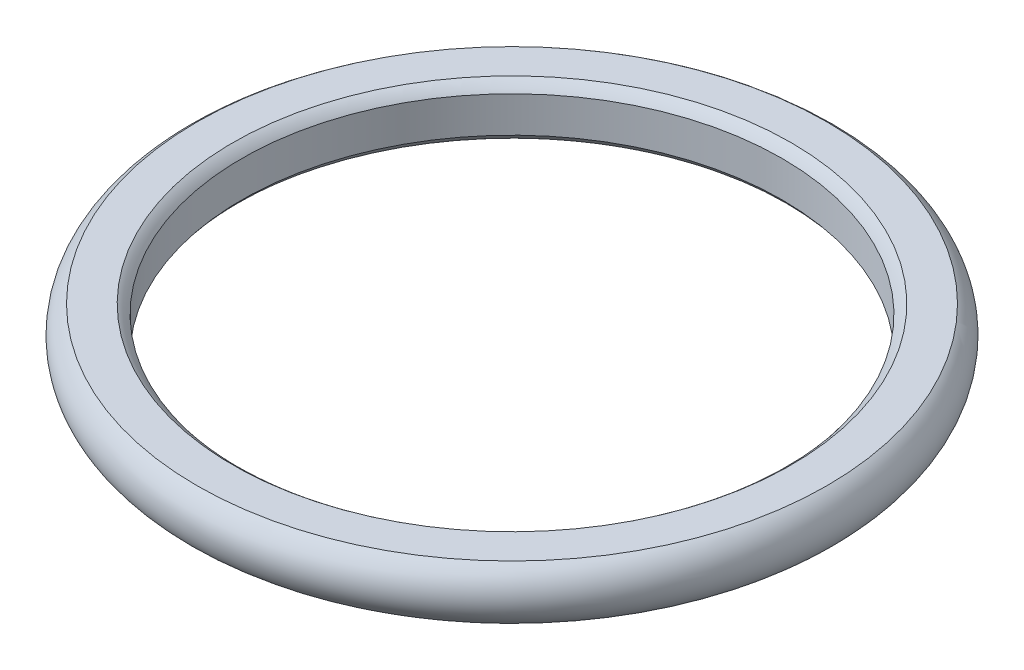
ISO-10303-21;
HEADER;
FILE_DESCRIPTION(('STEP AP214'),'2;1');
FILE_NAME('part.step','',(''),(''),'','','');
FILE_SCHEMA(('AUTOMOTIVE_DESIGN { 1 0 10303 214 1 1 1 1 }'));
ENDSEC;
DATA;
#1=APPLICATION_CONTEXT('core data for automotive mechanical design processes');
#2=APPLICATION_PROTOCOL_DEFINITION('international standard','automotive_design',2000,#1);
#3=PRODUCT_CONTEXT('',#1,'mechanical');
#4=PRODUCT('Part','Part','',(#3));
#5=PRODUCT_RELATED_PRODUCT_CATEGORY('part','',(#4));
#6=PRODUCT_DEFINITION_FORMATION('','',#4);
#7=PRODUCT_DEFINITION_CONTEXT('part definition',#1,'design');
#8=PRODUCT_DEFINITION('design','',#6,#7);
#9=PRODUCT_DEFINITION_SHAPE('','',#8);
#10=(LENGTH_UNIT() NAMED_UNIT(*) SI_UNIT(.MILLI.,.METRE.));
#11=(NAMED_UNIT(*) PLANE_ANGLE_UNIT() SI_UNIT($,.RADIAN.));
#12=(NAMED_UNIT(*) SI_UNIT($,.STERADIAN.) SOLID_ANGLE_UNIT());
#13=UNCERTAINTY_MEASURE_WITH_UNIT(LENGTH_MEASURE(1.E-05),#10,'distance_accuracy_value','');
#14=(GEOMETRIC_REPRESENTATION_CONTEXT(3) GLOBAL_UNCERTAINTY_ASSIGNED_CONTEXT((#13)) GLOBAL_UNIT_ASSIGNED_CONTEXT((#10,
#11,#12)) REPRESENTATION_CONTEXT('',''));
#15=CARTESIAN_POINT('',(0.,0.,0.));
#16=DIRECTION('',(0.,0.,1.));
#17=DIRECTION('',(1.,0.,0.));
#18=AXIS2_PLACEMENT_3D('',#15,#16,#17);
#19=CARTESIAN_POINT('',(0.,0.,0.));
#20=DIRECTION('',(0.,-1.,0.));
#21=DIRECTION('',(0.,0.,-1.));
#22=AXIS2_PLACEMENT_3D('',#19,#20,#21);
#23=TOROIDAL_SURFACE('',#22,27.5,3.);
#24=CARTESIAN_POINT('',(0.,-1.6583123951777,0.));
#25=DIRECTION('',(0.,1.,0.));
#26=DIRECTION('',(0.,0.,1.));
#27=AXIS2_PLACEMENT_3D('',#24,#25,#26);
#28=CIRCLE('',#27,25.);
#29=CARTESIAN_POINT('',(0.,-1.6583123951777,25.));
#30=VERTEX_POINT('',#29);
#31=EDGE_CURVE('E10',#30,#30,#28,.F.);
#32=ORIENTED_EDGE('',*,*,#31,.F.);
#33=EDGE_LOOP('',(#32));
#34=FACE_BOUND('',#33,.T.);
#35=CARTESIAN_POINT('',(0.,2.5,0.));
#36=DIRECTION('',(0.,1.,0.));
#37=DIRECTION('',(0.,0.,1.));
#38=AXIS2_PLACEMENT_3D('',#35,#36,#37);
#39=CIRCLE('',#38,29.1583123951777);
#40=CARTESIAN_POINT('',(0.,2.5,29.1583123951777));
#41=VERTEX_POINT('',#40);
#42=EDGE_CURVE('E39',#41,#41,#39,.F.);
#43=ORIENTED_EDGE('',*,*,#42,.T.);
#44=EDGE_LOOP('',(#43));
#45=FACE_BOUND('',#44,.T.);
#46=ADVANCED_FACE('F36',(#34,#45),#23,.T.);
#47=CARTESIAN_POINT('',(0.,1.6583123951777,0.));
#48=DIRECTION('',(0.,-1.,0.));
#49=DIRECTION('',(0.,0.,-1.));
#50=AXIS2_PLACEMENT_3D('',#47,#48,#49);
#51=CIRCLE('',#50,25.);
#52=CARTESIAN_POINT('',(0.,1.6583123951777,-25.));
#53=VERTEX_POINT('',#52);
#54=EDGE_CURVE('E43',#53,#53,#51,.F.);
#55=ORIENTED_EDGE('',*,*,#54,.F.);
#56=EDGE_LOOP('',(#55));
#57=FACE_BOUND('',#56,.T.);
#58=CARTESIAN_POINT('',(0.,2.5,0.));
#59=DIRECTION('',(0.,-1.,0.));
#60=DIRECTION('',(0.,0.,-1.));
#61=AXIS2_PLACEMENT_3D('',#58,#59,#60);
#62=CIRCLE('',#61,25.8416876048223);
#63=CARTESIAN_POINT('',(0.,2.5,-25.8416876048223));
#64=VERTEX_POINT('',#63);
#65=EDGE_CURVE('E49',#64,#64,#62,.F.);
#66=ORIENTED_EDGE('',*,*,#65,.T.);
#67=EDGE_LOOP('',(#66));
#68=FACE_BOUND('',#67,.T.);
#69=ADVANCED_FACE('F65',(#57,#68),#23,.T.);
#70=CARTESIAN_POINT('',(0.,-5.,0.));
#71=DIRECTION('',(0.,1.,0.));
#72=DIRECTION('',(0.,0.,1.));
#73=AXIS2_PLACEMENT_3D('',#70,#71,#72);
#74=CYLINDRICAL_SURFACE('',#73,25.);
#75=ORIENTED_EDGE('',*,*,#31,.T.);
#76=EDGE_LOOP('',(#75));
#77=FACE_BOUND('',#76,.T.);
#78=ORIENTED_EDGE('',*,*,#54,.T.);
#79=EDGE_LOOP('',(#78));
#80=FACE_BOUND('',#79,.T.);
#81=ADVANCED_FACE('F60',(#77,#80),#74,.F.);
#82=CARTESIAN_POINT('',(0.,2.5,0.));
#83=DIRECTION('',(0.,1.,0.));
#84=DIRECTION('',(0.,0.,1.));
#85=AXIS2_PLACEMENT_3D('',#82,#83,#84);
#86=PLANE('',#85);
#87=ORIENTED_EDGE('',*,*,#42,.F.);
#88=EDGE_LOOP('',(#87));
#89=FACE_BOUND('',#88,.T.);
#90=ORIENTED_EDGE('',*,*,#65,.F.);
#91=EDGE_LOOP('',(#90));
#92=FACE_BOUND('',#91,.T.);
#93=ADVANCED_FACE('F57',(#89,#92),#86,.T.);
#94=CLOSED_SHELL('',(#46,#69,#81,#93));
#95=MANIFOLD_SOLID_BREP('B2',#94);
#96=ADVANCED_BREP_SHAPE_REPRESENTATION('',(#18,#95),#14);
#97=SHAPE_DEFINITION_REPRESENTATION(#9,#96);
ENDSEC;
END-ISO-10303-21;
